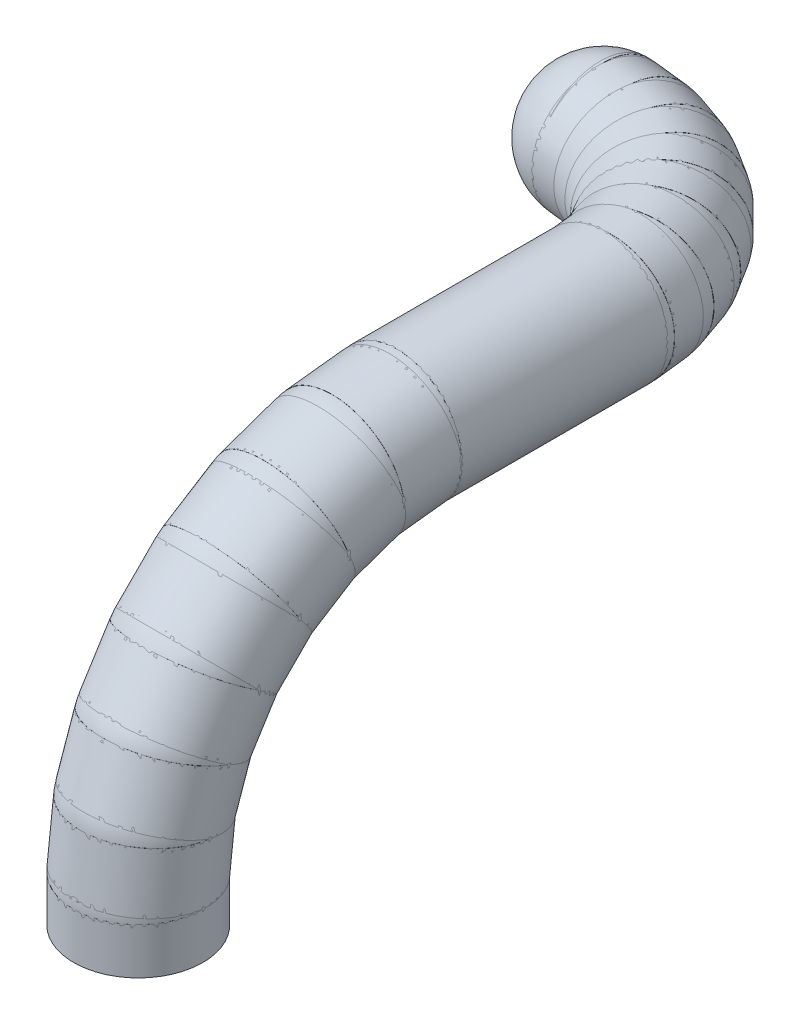
ISO-10303-21;
HEADER;
FILE_DESCRIPTION(('STEP AP214'),'2;1');
FILE_NAME('part.step','',(''),(''),'','','');
FILE_SCHEMA(('AUTOMOTIVE_DESIGN { 1 0 10303 214 1 1 1 1 }'));
ENDSEC;
DATA;
#1=APPLICATION_CONTEXT('core data for automotive mechanical design processes');
#2=APPLICATION_PROTOCOL_DEFINITION('international standard','automotive_design',2000,#1);
#3=PRODUCT_CONTEXT('',#1,'mechanical');
#4=PRODUCT('Part','Part','',(#3));
#5=PRODUCT_RELATED_PRODUCT_CATEGORY('part','',(#4));
#6=PRODUCT_DEFINITION_FORMATION('','',#4);
#7=PRODUCT_DEFINITION_CONTEXT('part definition',#1,'design');
#8=PRODUCT_DEFINITION('design','',#6,#7);
#9=PRODUCT_DEFINITION_SHAPE('','',#8);
#10=(LENGTH_UNIT() NAMED_UNIT(*) SI_UNIT(.MILLI.,.METRE.));
#11=(NAMED_UNIT(*) PLANE_ANGLE_UNIT() SI_UNIT($,.RADIAN.));
#12=(NAMED_UNIT(*) SI_UNIT($,.STERADIAN.) SOLID_ANGLE_UNIT());
#13=UNCERTAINTY_MEASURE_WITH_UNIT(LENGTH_MEASURE(1.E-05),#10,'distance_accuracy_value','');
#14=(GEOMETRIC_REPRESENTATION_CONTEXT(3) GLOBAL_UNCERTAINTY_ASSIGNED_CONTEXT((#13)) GLOBAL_UNIT_ASSIGNED_CONTEXT((#10,
#11,#12)) REPRESENTATION_CONTEXT('',''));
#15=CARTESIAN_POINT('',(0.,0.,0.));
#16=DIRECTION('',(0.,0.,1.));
#17=DIRECTION('',(1.,0.,0.));
#18=AXIS2_PLACEMENT_3D('',#15,#16,#17);
#19=CARTESIAN_POINT('',(24.,-97.5,196.));
#20=DIRECTION('',(1.,0.,0.));
#21=DIRECTION('',(0.,1.,0.));
#22=AXIS2_PLACEMENT_3D('',#19,#20,#21);
#23=PLANE('',#22);
#24=CARTESIAN_POINT('',(24.,-97.5,196.));
#25=DIRECTION('',(1.,0.,0.));
#26=DIRECTION('',(0.,0.,1.));
#27=AXIS2_PLACEMENT_3D('',#24,#25,#26);
#28=CIRCLE('',#27,3.5);
#29=CARTESIAN_POINT('',(24.,-97.5,199.5));
#30=VERTEX_POINT('',#29);
#31=EDGE_CURVE('P0_E11',#30,#30,#28,.T.);
#32=ORIENTED_EDGE('',*,*,#31,.F.);
#33=EDGE_LOOP('',(#32));
#34=FACE_BOUND('',#33,.T.);
#35=ADVANCED_FACE('P0_F16',(#34),#23,.F.);
#36=CARTESIAN_POINT('',(24.16,-97.5,196.));
#37=DIRECTION('',(1.,0.,0.));
#38=DIRECTION('',(0.,1.,0.));
#39=AXIS2_PLACEMENT_3D('',#36,#37,#38);
#40=PLANE('',#39);
#41=CARTESIAN_POINT('',(24.16,-97.5,196.));
#42=DIRECTION('',(1.,0.,0.));
#43=DIRECTION('',(0.,0.,1.));
#44=AXIS2_PLACEMENT_3D('',#41,#42,#43);
#45=CIRCLE('',#44,3.5);
#46=CARTESIAN_POINT('',(24.16,-97.5,199.5));
#47=VERTEX_POINT('',#46);
#48=EDGE_CURVE('P0_E40',#47,#47,#45,.T.);
#49=ORIENTED_EDGE('',*,*,#48,.T.);
#50=EDGE_LOOP('',(#49));
#51=FACE_BOUND('',#50,.T.);
#52=ADVANCED_FACE('P0_F43',(#51),#40,.T.);
#53=CARTESIAN_POINT('',(24.,-97.5,196.));
#54=DIRECTION('',(1.,0.,0.));
#55=DIRECTION('',(0.,0.,1.));
#56=AXIS2_PLACEMENT_3D('',#53,#54,#55);
#57=CYLINDRICAL_SURFACE('',#56,3.5);
#58=ORIENTED_EDGE('',*,*,#48,.F.);
#59=DIRECTION('',(1.,0.,0.));
#60=VECTOR('',#59,1.);
#61=CARTESIAN_POINT('',(24.,-97.5,199.5));
#62=LINE('',#61,#60);
#63=EDGE_CURVE('P0_E24',#30,#47,#62,.T.);
#64=ORIENTED_EDGE('',*,*,#63,.F.);
#65=ORIENTED_EDGE('',*,*,#31,.T.);
#66=ORIENTED_EDGE('',*,*,#63,.T.);
#67=EDGE_LOOP('',(#58,#64,#65,#66));
#68=FACE_BOUND('',#67,.T.);
#69=ADVANCED_FACE('P0_F39',(#68),#57,.T.);
#70=CLOSED_SHELL('',(#35,#52,#69));
#71=MANIFOLD_SOLID_BREP('P0_B1',#70);
#72=CARTESIAN_POINT('',(24.16,-97.5,196.));
#73=DIRECTION('',(0.993712209893274,0.,0.111964476103031));
#74=DIRECTION('',(0.,-1.,0.));
#75=AXIS2_PLACEMENT_3D('',#72,#73,#74);
#76=PLANE('',#75);
#77=CARTESIAN_POINT('',(24.16,-97.5,196.));
#78=DIRECTION('',(0.993712209893274,0.,0.111964476103031));
#79=DIRECTION('',(-0.111964476103031,0.,0.993712209893274));
#80=AXIS2_PLACEMENT_3D('',#77,#78,#79);
#81=CIRCLE('',#80,3.5);
#82=CARTESIAN_POINT('',(23.768124333638,-97.5,199.47799273462));
#83=VERTEX_POINT('',#82);
#84=EDGE_CURVE('P1_E11',#83,#83,#81,.T.);
#85=ORIENTED_EDGE('',*,*,#84,.F.);
#86=EDGE_LOOP('',(#85));
#87=FACE_BOUND('',#86,.T.);
#88=ADVANCED_FACE('P1_F16',(#87),#76,.F.);
#89=CARTESIAN_POINT('',(25.904564122218,-97.5,196.19656516849));
#90=DIRECTION('',(0.993712209893274,0.,0.111964476103031));
#91=DIRECTION('',(0.,-1.,0.));
#92=AXIS2_PLACEMENT_3D('',#89,#90,#91);
#93=PLANE('',#92);
#94=CARTESIAN_POINT('',(25.904564122218,-97.5,196.19656516849));
#95=DIRECTION('',(0.993712209893274,0.,0.111964476103031));
#96=DIRECTION('',(-0.111964476103031,0.,0.993712209893274));
#97=AXIS2_PLACEMENT_3D('',#94,#95,#96);
#98=CIRCLE('',#97,3.5);
#99=CARTESIAN_POINT('',(25.512688455856,-97.5,199.67455790312));
#100=VERTEX_POINT('',#99);
#101=EDGE_CURVE('P1_E40',#100,#100,#98,.T.);
#102=ORIENTED_EDGE('',*,*,#101,.T.);
#103=EDGE_LOOP('',(#102));
#104=FACE_BOUND('',#103,.T.);
#105=ADVANCED_FACE('P1_F44',(#104),#93,.T.);
#106=CARTESIAN_POINT('',(24.16,-97.5,196.));
#107=DIRECTION('',(0.993712209893274,0.,0.111964476103031));
#108=DIRECTION('',(-0.111964476103031,0.,0.993712209893274));
#109=AXIS2_PLACEMENT_3D('',#106,#107,#108);
#110=CYLINDRICAL_SURFACE('',#109,3.5);
#111=ORIENTED_EDGE('',*,*,#101,.F.);
#112=DIRECTION('',(0.993712209893274,0.,0.111964476103031));
#113=VECTOR('',#112,1.);
#114=CARTESIAN_POINT('',(23.768124333638,-97.5,199.47799273462));
#115=LINE('',#114,#113);
#116=EDGE_CURVE('P1_E24',#83,#100,#115,.T.);
#117=ORIENTED_EDGE('',*,*,#116,.F.);
#118=ORIENTED_EDGE('',*,*,#84,.T.);
#119=ORIENTED_EDGE('',*,*,#116,.T.);
#120=EDGE_LOOP('',(#111,#117,#118,#119));
#121=FACE_BOUND('',#120,.T.);
#122=ADVANCED_FACE('P1_F39',(#121),#110,.T.);
#123=CLOSED_SHELL('',(#88,#105,#122));
#124=MANIFOLD_SOLID_BREP('P1_B1',#123);
#125=CARTESIAN_POINT('',(25.904564122218,-97.5,196.19656516849));
#126=DIRECTION('',(0.943883330308379,0.,0.330279061955133));
#127=DIRECTION('',(0.,-1.,0.));
#128=AXIS2_PLACEMENT_3D('',#125,#126,#127);
#129=PLANE('',#128);
#130=CARTESIAN_POINT('',(25.904564122218,-97.5,196.19656516849));
#131=DIRECTION('',(0.94388333030838,0.,0.330279061955133));
#132=DIRECTION('',(-0.330279061955133,0.,0.94388333030838));
#133=AXIS2_PLACEMENT_3D('',#130,#131,#132);
#134=CIRCLE('',#133,3.5);
#135=CARTESIAN_POINT('',(24.748587405374,-97.5,199.50015682457));
#136=VERTEX_POINT('',#135);
#137=EDGE_CURVE('P2_E11',#136,#136,#134,.T.);
#138=ORIENTED_EDGE('',*,*,#137,.F.);
#139=EDGE_LOOP('',(#138));
#140=FACE_BOUND('',#139,.T.);
#141=ADVANCED_FACE('P2_F16',(#140),#129,.F.);
#142=CARTESIAN_POINT('',(27.561648514682,-97.5,196.77640407564));
#143=DIRECTION('',(0.943883330308379,0.,0.330279061955133));
#144=DIRECTION('',(0.,-1.,0.));
#145=AXIS2_PLACEMENT_3D('',#142,#143,#144);
#146=PLANE('',#145);
#147=CARTESIAN_POINT('',(27.561648514682,-97.5,196.77640407564));
#148=DIRECTION('',(0.94388333030838,0.,0.330279061955133));
#149=DIRECTION('',(-0.330279061955133,0.,0.94388333030838));
#150=AXIS2_PLACEMENT_3D('',#147,#148,#149);
#151=CIRCLE('',#150,3.5);
#152=CARTESIAN_POINT('',(26.405671797839,-97.5,200.07999573172));
#153=VERTEX_POINT('',#152);
#154=EDGE_CURVE('P2_E40',#153,#153,#151,.T.);
#155=ORIENTED_EDGE('',*,*,#154,.T.);
#156=EDGE_LOOP('',(#155));
#157=FACE_BOUND('',#156,.T.);
#158=ADVANCED_FACE('P2_F43',(#157),#146,.T.);
#159=CARTESIAN_POINT('',(25.904564122218,-97.5,196.19656516849));
#160=DIRECTION('',(0.94388333030838,0.,0.330279061955133));
#161=DIRECTION('',(-0.330279061955133,0.,0.94388333030838));
#162=AXIS2_PLACEMENT_3D('',#159,#160,#161);
#163=CYLINDRICAL_SURFACE('',#162,3.5);
#164=ORIENTED_EDGE('',*,*,#154,.F.);
#165=DIRECTION('',(0.943883330308379,0.,0.330279061955133));
#166=VECTOR('',#165,1.);
#167=CARTESIAN_POINT('',(24.748587405374,-97.5,199.50015682457));
#168=LINE('',#167,#166);
#169=EDGE_CURVE('P2_E20',#136,#153,#168,.T.);
#170=ORIENTED_EDGE('',*,*,#169,.F.);
#171=ORIENTED_EDGE('',*,*,#137,.T.);
#172=ORIENTED_EDGE('',*,*,#169,.T.);
#173=EDGE_LOOP('',(#164,#170,#171,#172));
#174=FACE_BOUND('',#173,.T.);
#175=ADVANCED_FACE('P2_F18',(#174),#163,.T.);
#176=CLOSED_SHELL('',(#141,#158,#175));
#177=MANIFOLD_SOLID_BREP('P2_B1',#176);
#178=CARTESIAN_POINT('',(27.561648514682,-97.5,196.77640407564));
#179=DIRECTION('',(0.846724199228355,0.,0.532032076515223));
#180=DIRECTION('',(0.,-1.,0.));
#181=AXIS2_PLACEMENT_3D('',#178,#179,#180);
#182=PLANE('',#181);
#183=CARTESIAN_POINT('',(27.561648514682,-97.5,196.77640407564));
#184=DIRECTION('',(0.846724199228355,0.,0.532032076515223));
#185=DIRECTION('',(-0.532032076515223,0.,0.846724199228355));
#186=AXIS2_PLACEMENT_3D('',#183,#184,#185);
#187=CIRCLE('',#186,3.5);
#188=CARTESIAN_POINT('',(25.699536246878,-97.5,199.73993877294));
#189=VERTEX_POINT('',#188);
#190=EDGE_CURVE('P3_E11',#189,#189,#187,.T.);
#191=ORIENTED_EDGE('',*,*,#190,.F.);
#192=EDGE_LOOP('',(#191));
#193=FACE_BOUND('',#192,.T.);
#194=ADVANCED_FACE('P3_F16',(#193),#182,.F.);
#195=CARTESIAN_POINT('',(29.048160046572,-97.5,197.71044117745));
#196=DIRECTION('',(0.846724199228355,0.,0.532032076515223));
#197=DIRECTION('',(0.,-1.,0.));
#198=AXIS2_PLACEMENT_3D('',#195,#196,#197);
#199=PLANE('',#198);
#200=CARTESIAN_POINT('',(29.048160046572,-97.5,197.71044117745));
#201=DIRECTION('',(0.846724199228355,0.,0.532032076515223));
#202=DIRECTION('',(-0.532032076515223,0.,0.846724199228355));
#203=AXIS2_PLACEMENT_3D('',#200,#201,#202);
#204=CIRCLE('',#203,3.5);
#205=CARTESIAN_POINT('',(27.186047778769,-97.5,200.67397587475));
#206=VERTEX_POINT('',#205);
#207=EDGE_CURVE('P3_E20',#206,#206,#204,.T.);
#208=ORIENTED_EDGE('',*,*,#207,.T.);
#209=EDGE_LOOP('',(#208));
#210=FACE_BOUND('',#209,.T.);
#211=ADVANCED_FACE('P3_F18',(#210),#199,.T.);
#212=CARTESIAN_POINT('',(27.561648514682,-97.5,196.77640407564));
#213=DIRECTION('',(0.846724199228355,0.,0.532032076515223));
#214=DIRECTION('',(-0.532032076515223,0.,0.846724199228355));
#215=AXIS2_PLACEMENT_3D('',#212,#213,#214);
#216=CYLINDRICAL_SURFACE('',#215,3.5);
#217=ORIENTED_EDGE('',*,*,#207,.F.);
#218=DIRECTION('',(0.846724199228355,0.,0.532032076515223));
#219=VECTOR('',#218,1.);
#220=CARTESIAN_POINT('',(25.699536246878,-97.5,199.73993877294));
#221=LINE('',#220,#219);
#222=EDGE_CURVE('P3_E27',#189,#206,#221,.T.);
#223=ORIENTED_EDGE('',*,*,#222,.F.);
#224=ORIENTED_EDGE('',*,*,#190,.T.);
#225=ORIENTED_EDGE('',*,*,#222,.T.);
#226=EDGE_LOOP('',(#217,#223,#224,#225));
#227=FACE_BOUND('',#226,.T.);
#228=ADVANCED_FACE('P3_F42',(#227),#216,.T.);
#229=CLOSED_SHELL('',(#194,#211,#228));
#230=MANIFOLD_SOLID_BREP('P3_B1',#229);
#231=CARTESIAN_POINT('',(29.048160046572,-97.5,197.71044117745));
#232=DIRECTION('',(0.707106781186548,0.,0.707106781186548));
#233=DIRECTION('',(0.,-1.,0.));
#234=AXIS2_PLACEMENT_3D('',#231,#232,#233);
#235=PLANE('',#234);
#236=CARTESIAN_POINT('',(29.048160046572,-97.5,197.71044117745));
#237=DIRECTION('',(0.707106781186548,0.,0.707106781186548));
#238=DIRECTION('',(-0.707106781186548,0.,0.707106781186548));
#239=AXIS2_PLACEMENT_3D('',#236,#237,#238);
#240=CIRCLE('',#239,3.5);
#241=CARTESIAN_POINT('',(26.57328631242,-97.5,200.1853149116));
#242=VERTEX_POINT('',#241);
#243=EDGE_CURVE('P4_E11',#242,#242,#240,.T.);
#244=ORIENTED_EDGE('',*,*,#243,.F.);
#245=EDGE_LOOP('',(#244));
#246=FACE_BOUND('',#245,.T.);
#247=ADVANCED_FACE('P4_F16',(#246),#235,.F.);
#248=CARTESIAN_POINT('',(30.289558822549,-97.5,198.95183995342));
#249=DIRECTION('',(0.707106781186548,0.,0.707106781186548));
#250=DIRECTION('',(0.,-1.,0.));
#251=AXIS2_PLACEMENT_3D('',#248,#249,#250);
#252=PLANE('',#251);
#253=CARTESIAN_POINT('',(30.289558822549,-97.5,198.95183995342));
#254=DIRECTION('',(0.707106781186548,0.,0.707106781186548));
#255=DIRECTION('',(-0.707106781186548,0.,0.707106781186548));
#256=AXIS2_PLACEMENT_3D('',#253,#254,#255);
#257=CIRCLE('',#256,3.5);
#258=CARTESIAN_POINT('',(27.814685088396,-97.5,201.42671368758));
#259=VERTEX_POINT('',#258);
#260=EDGE_CURVE('P4_E19',#259,#259,#257,.T.);
#261=ORIENTED_EDGE('',*,*,#260,.T.);
#262=EDGE_LOOP('',(#261));
#263=FACE_BOUND('',#262,.T.);
#264=ADVANCED_FACE('P4_F44',(#263),#252,.T.);
#265=CARTESIAN_POINT('',(29.048160046572,-97.5,197.71044117745));
#266=DIRECTION('',(0.707106781186548,0.,0.707106781186548));
#267=DIRECTION('',(-0.707106781186548,0.,0.707106781186548));
#268=AXIS2_PLACEMENT_3D('',#265,#266,#267);
#269=CYLINDRICAL_SURFACE('',#268,3.5);
#270=ORIENTED_EDGE('',*,*,#260,.F.);
#271=DIRECTION('',(0.707106781186548,0.,0.707106781186548));
#272=VECTOR('',#271,1.);
#273=CARTESIAN_POINT('',(26.57328631242,-97.5,200.1853149116));
#274=LINE('',#273,#272);
#275=EDGE_CURVE('P4_E25',#242,#259,#274,.T.);
#276=ORIENTED_EDGE('',*,*,#275,.F.);
#277=ORIENTED_EDGE('',*,*,#243,.T.);
#278=ORIENTED_EDGE('',*,*,#275,.T.);
#279=EDGE_LOOP('',(#270,#276,#277,#278));
#280=FACE_BOUND('',#279,.T.);
#281=ADVANCED_FACE('P4_F40',(#280),#269,.T.);
#282=CLOSED_SHELL('',(#247,#264,#281));
#283=MANIFOLD_SOLID_BREP('P4_B1',#282);
#284=CARTESIAN_POINT('',(30.289558822549,-97.5,198.95183995342));
#285=DIRECTION('',(0.532032076515223,0.,0.846724199228355));
#286=DIRECTION('',(0.,-1.,0.));
#287=AXIS2_PLACEMENT_3D('',#284,#285,#286);
#288=PLANE('',#287);
#289=CARTESIAN_POINT('',(30.289558822549,-97.5,198.95183995342));
#290=DIRECTION('',(0.532032076515223,0.,0.846724199228355));
#291=DIRECTION('',(0.846724199228355,0.,-0.532032076515223));
#292=AXIS2_PLACEMENT_3D('',#289,#290,#291);
#293=CIRCLE('',#292,3.5);
#294=CARTESIAN_POINT('',(33.253093519848,-97.5,197.08972768562));
#295=VERTEX_POINT('',#294);
#296=EDGE_CURVE('P5_E11',#295,#295,#293,.T.);
#297=ORIENTED_EDGE('',*,*,#296,.F.);
#298=EDGE_LOOP('',(#297));
#299=FACE_BOUND('',#298,.T.);
#300=ADVANCED_FACE('P5_F16',(#299),#288,.F.);
#301=CARTESIAN_POINT('',(31.223595924355,-97.5,200.43835148531));
#302=DIRECTION('',(0.532032076515223,0.,0.846724199228355));
#303=DIRECTION('',(0.,-1.,0.));
#304=AXIS2_PLACEMENT_3D('',#301,#302,#303);
#305=PLANE('',#304);
#306=CARTESIAN_POINT('',(31.223595924355,-97.5,200.43835148531));
#307=DIRECTION('',(0.532032076515223,0.,0.846724199228355));
#308=DIRECTION('',(0.846724199228355,0.,-0.532032076515223));
#309=AXIS2_PLACEMENT_3D('',#306,#307,#308);
#310=CIRCLE('',#309,3.5);
#311=CARTESIAN_POINT('',(34.187130621654,-97.5,198.57623921751));
#312=VERTEX_POINT('',#311);
#313=EDGE_CURVE('P5_E41',#312,#312,#310,.T.);
#314=ORIENTED_EDGE('',*,*,#313,.T.);
#315=EDGE_LOOP('',(#314));
#316=FACE_BOUND('',#315,.T.);
#317=ADVANCED_FACE('P5_F44',(#316),#305,.T.);
#318=CARTESIAN_POINT('',(30.289558822549,-97.5,198.95183995342));
#319=DIRECTION('',(0.532032076515223,0.,0.846724199228355));
#320=DIRECTION('',(0.846724199228355,0.,-0.532032076515223));
#321=AXIS2_PLACEMENT_3D('',#318,#319,#320);
#322=CYLINDRICAL_SURFACE('',#321,3.5);
#323=ORIENTED_EDGE('',*,*,#313,.F.);
#324=DIRECTION('',(0.532032076515223,0.,0.846724199228355));
#325=VECTOR('',#324,1.);
#326=CARTESIAN_POINT('',(33.253093519848,-97.5,197.08972768562));
#327=LINE('',#326,#325);
#328=EDGE_CURVE('P5_E20',#295,#312,#327,.T.);
#329=ORIENTED_EDGE('',*,*,#328,.F.);
#330=ORIENTED_EDGE('',*,*,#296,.T.);
#331=ORIENTED_EDGE('',*,*,#328,.T.);
#332=EDGE_LOOP('',(#323,#329,#330,#331));
#333=FACE_BOUND('',#332,.T.);
#334=ADVANCED_FACE('P5_F18',(#333),#322,.T.);
#335=CLOSED_SHELL('',(#300,#317,#334));
#336=MANIFOLD_SOLID_BREP('P5_B1',#335);
#337=CARTESIAN_POINT('',(31.223595924355,-97.5,200.43835148531));
#338=DIRECTION('',(0.330279061955133,0.,0.943883330308379));
#339=DIRECTION('',(0.,-1.,0.));
#340=AXIS2_PLACEMENT_3D('',#337,#338,#339);
#341=PLANE('',#340);
#342=CARTESIAN_POINT('',(31.223595924355,-97.5,200.43835148531));
#343=DIRECTION('',(0.330279061955133,0.,0.94388333030838));
#344=DIRECTION('',(0.94388333030838,0.,-0.330279061955133));
#345=AXIS2_PLACEMENT_3D('',#342,#343,#344);
#346=CIRCLE('',#345,3.5);
#347=CARTESIAN_POINT('',(34.527187580434,-97.5,199.28237476847));
#348=VERTEX_POINT('',#347);
#349=EDGE_CURVE('P6_E11',#348,#348,#346,.T.);
#350=ORIENTED_EDGE('',*,*,#349,.F.);
#351=EDGE_LOOP('',(#350));
#352=FACE_BOUND('',#351,.T.);
#353=ADVANCED_FACE('P6_F16',(#352),#341,.F.);
#354=CARTESIAN_POINT('',(31.803434831505,-97.5,202.09543587778));
#355=DIRECTION('',(0.330279061955133,0.,0.943883330308379));
#356=DIRECTION('',(0.,-1.,0.));
#357=AXIS2_PLACEMENT_3D('',#354,#355,#356);
#358=PLANE('',#357);
#359=CARTESIAN_POINT('',(31.803434831505,-97.5,202.09543587778));
#360=DIRECTION('',(0.330279061955133,0.,0.94388333030838));
#361=DIRECTION('',(0.94388333030838,0.,-0.330279061955133));
#362=AXIS2_PLACEMENT_3D('',#359,#360,#361);
#363=CIRCLE('',#362,3.5);
#364=CARTESIAN_POINT('',(35.107026487585,-97.5,200.93945916093));
#365=VERTEX_POINT('',#364);
#366=EDGE_CURVE('P6_E40',#365,#365,#363,.T.);
#367=ORIENTED_EDGE('',*,*,#366,.T.);
#368=EDGE_LOOP('',(#367));
#369=FACE_BOUND('',#368,.T.);
#370=ADVANCED_FACE('P6_F43',(#369),#358,.T.);
#371=CARTESIAN_POINT('',(31.223595924355,-97.5,200.43835148531));
#372=DIRECTION('',(0.330279061955133,0.,0.94388333030838));
#373=DIRECTION('',(0.94388333030838,0.,-0.330279061955133));
#374=AXIS2_PLACEMENT_3D('',#371,#372,#373);
#375=CYLINDRICAL_SURFACE('',#374,3.5);
#376=ORIENTED_EDGE('',*,*,#366,.F.);
#377=DIRECTION('',(0.330279061955133,0.,0.943883330308379));
#378=VECTOR('',#377,1.);
#379=CARTESIAN_POINT('',(34.527187580434,-97.5,199.28237476847));
#380=LINE('',#379,#378);
#381=EDGE_CURVE('P6_E25',#348,#365,#380,.T.);
#382=ORIENTED_EDGE('',*,*,#381,.F.);
#383=ORIENTED_EDGE('',*,*,#349,.T.);
#384=ORIENTED_EDGE('',*,*,#381,.T.);
#385=EDGE_LOOP('',(#376,#382,#383,#384));
#386=FACE_BOUND('',#385,.T.);
#387=ADVANCED_FACE('P6_F39',(#386),#375,.T.);
#388=CLOSED_SHELL('',(#353,#370,#387));
#389=MANIFOLD_SOLID_BREP('P6_B1',#388);
#390=CARTESIAN_POINT('',(31.803434831505,-97.5,202.09543587778));
#391=DIRECTION('',(0.111964476103031,0.,0.993712209893274));
#392=DIRECTION('',(0.,-1.,0.));
#393=AXIS2_PLACEMENT_3D('',#390,#391,#392);
#394=PLANE('',#393);
#395=CARTESIAN_POINT('',(31.803434831505,-97.5,202.09543587778));
#396=DIRECTION('',(0.111964476103031,0.,0.993712209893274));
#397=DIRECTION('',(0.993712209893274,0.,-0.111964476103031));
#398=AXIS2_PLACEMENT_3D('',#395,#396,#397);
#399=CIRCLE('',#398,3.5);
#400=CARTESIAN_POINT('',(35.281427566132,-97.5,201.70356021142));
#401=VERTEX_POINT('',#400);
#402=EDGE_CURVE('P7_E11',#401,#401,#399,.T.);
#403=ORIENTED_EDGE('',*,*,#402,.F.);
#404=EDGE_LOOP('',(#403));
#405=FACE_BOUND('',#404,.T.);
#406=ADVANCED_FACE('P7_F16',(#405),#394,.F.);
#407=CARTESIAN_POINT('',(32.,-97.5,203.84));
#408=DIRECTION('',(0.111964476103031,0.,0.993712209893274));
#409=DIRECTION('',(0.,-1.,0.));
#410=AXIS2_PLACEMENT_3D('',#407,#408,#409);
#411=PLANE('',#410);
#412=CARTESIAN_POINT('',(32.,-97.5,203.84));
#413=DIRECTION('',(0.111964476103031,0.,0.993712209893274));
#414=DIRECTION('',(0.993712209893274,0.,-0.111964476103031));
#415=AXIS2_PLACEMENT_3D('',#412,#413,#414);
#416=CIRCLE('',#415,3.5);
#417=CARTESIAN_POINT('',(35.477992734626,-97.5,203.44812433363));
#418=VERTEX_POINT('',#417);
#419=EDGE_CURVE('P7_E41',#418,#418,#416,.T.);
#420=ORIENTED_EDGE('',*,*,#419,.T.);
#421=EDGE_LOOP('',(#420));
#422=FACE_BOUND('',#421,.T.);
#423=ADVANCED_FACE('P7_F44',(#422),#411,.T.);
#424=CARTESIAN_POINT('',(31.803434831505,-97.5,202.09543587778));
#425=DIRECTION('',(0.111964476103031,0.,0.993712209893274));
#426=DIRECTION('',(0.993712209893274,0.,-0.111964476103031));
#427=AXIS2_PLACEMENT_3D('',#424,#425,#426);
#428=CYLINDRICAL_SURFACE('',#427,3.5);
#429=ORIENTED_EDGE('',*,*,#419,.F.);
#430=DIRECTION('',(0.111964476103031,0.,0.993712209893274));
#431=VECTOR('',#430,1.);
#432=CARTESIAN_POINT('',(35.281427566132,-97.5,201.70356021142));
#433=LINE('',#432,#431);
#434=EDGE_CURVE('P7_E19',#401,#418,#433,.T.);
#435=ORIENTED_EDGE('',*,*,#434,.F.);
#436=ORIENTED_EDGE('',*,*,#402,.T.);
#437=ORIENTED_EDGE('',*,*,#434,.T.);
#438=EDGE_LOOP('',(#429,#435,#436,#437));
#439=FACE_BOUND('',#438,.T.);
#440=ADVANCED_FACE('P7_F40',(#439),#428,.T.);
#441=CLOSED_SHELL('',(#406,#423,#440));
#442=MANIFOLD_SOLID_BREP('P7_B1',#441);
#443=CARTESIAN_POINT('',(32.,-97.5,203.84));
#444=DIRECTION('',(0.,0.,1.));
#445=DIRECTION('',(1.,0.,0.));
#446=AXIS2_PLACEMENT_3D('',#443,#444,#445);
#447=PLANE('',#446);
#448=CARTESIAN_POINT('',(32.,-97.5,203.84));
#449=DIRECTION('',(0.,0.,1.));
#450=DIRECTION('',(1.,0.,0.));
#451=AXIS2_PLACEMENT_3D('',#448,#449,#450);
#452=CIRCLE('',#451,3.5);
#453=CARTESIAN_POINT('',(35.5,-97.5,203.84));
#454=VERTEX_POINT('',#453);
#455=EDGE_CURVE('P8_E11',#454,#454,#452,.T.);
#456=ORIENTED_EDGE('',*,*,#455,.F.);
#457=EDGE_LOOP('',(#456));
#458=FACE_BOUND('',#457,.T.);
#459=ADVANCED_FACE('P8_F16',(#458),#447,.F.);
#460=CARTESIAN_POINT('',(32.,-97.5,215.));
#461=DIRECTION('',(0.,0.,1.));
#462=DIRECTION('',(1.,0.,0.));
#463=AXIS2_PLACEMENT_3D('',#460,#461,#462);
#464=PLANE('',#463);
#465=CARTESIAN_POINT('',(32.,-97.5,215.));
#466=DIRECTION('',(0.,0.,1.));
#467=DIRECTION('',(1.,0.,0.));
#468=AXIS2_PLACEMENT_3D('',#465,#466,#467);
#469=CIRCLE('',#468,3.5);
#470=CARTESIAN_POINT('',(35.5,-97.5,215.));
#471=VERTEX_POINT('',#470);
#472=EDGE_CURVE('P8_E41',#471,#471,#469,.T.);
#473=ORIENTED_EDGE('',*,*,#472,.T.);
#474=EDGE_LOOP('',(#473));
#475=FACE_BOUND('',#474,.T.);
#476=ADVANCED_FACE('P8_F44',(#475),#464,.T.);
#477=CARTESIAN_POINT('',(32.,-97.5,203.84));
#478=DIRECTION('',(0.,0.,1.));
#479=DIRECTION('',(1.,0.,0.));
#480=AXIS2_PLACEMENT_3D('',#477,#478,#479);
#481=CYLINDRICAL_SURFACE('',#480,3.5);
#482=ORIENTED_EDGE('',*,*,#472,.F.);
#483=DIRECTION('',(0.,0.,1.));
#484=VECTOR('',#483,1.);
#485=CARTESIAN_POINT('',(35.5,-97.5,203.84));
#486=LINE('',#485,#484);
#487=EDGE_CURVE('P8_E19',#454,#471,#486,.T.);
#488=ORIENTED_EDGE('',*,*,#487,.F.);
#489=ORIENTED_EDGE('',*,*,#455,.T.);
#490=ORIENTED_EDGE('',*,*,#487,.T.);
#491=EDGE_LOOP('',(#482,#488,#489,#490));
#492=FACE_BOUND('',#491,.T.);
#493=ADVANCED_FACE('P8_F40',(#492),#481,.T.);
#494=CLOSED_SHELL('',(#459,#476,#493));
#495=MANIFOLD_SOLID_BREP('P8_B1',#494);
#496=CARTESIAN_POINT('',(32.,-97.5,215.));
#497=DIRECTION('',(0.,-0.111964476103031,0.993712209893274));
#498=DIRECTION('',(-1.,0.,0.));
#499=AXIS2_PLACEMENT_3D('',#496,#497,#498);
#500=PLANE('',#499);
#501=CARTESIAN_POINT('',(32.,-97.5,215.));
#502=DIRECTION('',(0.,-0.111964476103031,0.993712209893274));
#503=DIRECTION('',(0.,0.993712209893274,0.111964476103031));
#504=AXIS2_PLACEMENT_3D('',#501,#502,#503);
#505=CIRCLE('',#504,3.5);
#506=CARTESIAN_POINT('',(32.,-94.02200726537,215.39187566636));
#507=VERTEX_POINT('',#506);
#508=EDGE_CURVE('P9_E11',#507,#507,#505,.T.);
#509=ORIENTED_EDGE('',*,*,#508,.F.);
#510=EDGE_LOOP('',(#509));
#511=FACE_BOUND('',#510,.T.);
#512=ADVANCED_FACE('P9_F16',(#511),#500,.F.);
#513=CARTESIAN_POINT('',(32.,-97.85100922945,218.11529307538));
#514=DIRECTION('',(0.,-0.111964476103031,0.993712209893274));
#515=DIRECTION('',(-1.,0.,0.));
#516=AXIS2_PLACEMENT_3D('',#513,#514,#515);
#517=PLANE('',#516);
#518=CARTESIAN_POINT('',(32.,-97.85100922945,218.11529307538));
#519=DIRECTION('',(0.,-0.111964476103031,0.993712209893274));
#520=DIRECTION('',(0.,0.993712209893274,0.111964476103031));
#521=AXIS2_PLACEMENT_3D('',#518,#519,#520);
#522=CIRCLE('',#521,3.5);
#523=CARTESIAN_POINT('',(32.,-94.37301649482,218.50716874175));
#524=VERTEX_POINT('',#523);
#525=EDGE_CURVE('P9_E40',#524,#524,#522,.T.);
#526=ORIENTED_EDGE('',*,*,#525,.T.);
#527=EDGE_LOOP('',(#526));
#528=FACE_BOUND('',#527,.T.);
#529=ADVANCED_FACE('P9_F43',(#528),#517,.T.);
#530=CARTESIAN_POINT('',(32.,-97.5,215.));
#531=DIRECTION('',(0.,-0.111964476103031,0.993712209893274));
#532=DIRECTION('',(0.,0.993712209893274,0.111964476103031));
#533=AXIS2_PLACEMENT_3D('',#530,#531,#532);
#534=CYLINDRICAL_SURFACE('',#533,3.5);
#535=ORIENTED_EDGE('',*,*,#525,.F.);
#536=DIRECTION('',(0.,-0.111964476103031,0.993712209893274));
#537=VECTOR('',#536,1.);
#538=CARTESIAN_POINT('',(32.,-94.02200726537,215.39187566636));
#539=LINE('',#538,#537);
#540=EDGE_CURVE('P9_E19',#507,#524,#539,.T.);
#541=ORIENTED_EDGE('',*,*,#540,.F.);
#542=ORIENTED_EDGE('',*,*,#508,.T.);
#543=ORIENTED_EDGE('',*,*,#540,.T.);
#544=EDGE_LOOP('',(#535,#541,#542,#543));
#545=FACE_BOUND('',#544,.T.);
#546=ADVANCED_FACE('P9_F39',(#545),#534,.T.);
#547=CLOSED_SHELL('',(#512,#529,#546));
#548=MANIFOLD_SOLID_BREP('P9_B1',#547);
#549=CARTESIAN_POINT('',(32.,-97.85100922945,218.11529307538));
#550=DIRECTION('',(0.,-0.330279061955133,0.943883330308379));
#551=DIRECTION('',(-1.,0.,0.));
#552=AXIS2_PLACEMENT_3D('',#549,#550,#551);
#553=PLANE('',#552);
#554=CARTESIAN_POINT('',(32.,-97.85100922945,218.11529307538));
#555=DIRECTION('',(0.,-0.330279061955133,0.94388333030838));
#556=DIRECTION('',(0.,0.94388333030838,0.330279061955133));
#557=AXIS2_PLACEMENT_3D('',#554,#555,#556);
#558=CIRCLE('',#557,3.5);
#559=CARTESIAN_POINT('',(32.,-94.54741757337,219.27126979223));
#560=VERTEX_POINT('',#559);
#561=EDGE_CURVE('P10_E11',#560,#560,#558,.T.);
#562=ORIENTED_EDGE('',*,*,#561,.F.);
#563=EDGE_LOOP('',(#562));
#564=FACE_BOUND('',#563,.T.);
#565=ADVANCED_FACE('P10_F16',(#564),#553,.F.);
#566=CARTESIAN_POINT('',(32.,-98.88643584936,221.07437234764));
#567=DIRECTION('',(0.,-0.330279061955133,0.943883330308379));
#568=DIRECTION('',(-1.,0.,0.));
#569=AXIS2_PLACEMENT_3D('',#566,#567,#568);
#570=PLANE('',#569);
#571=CARTESIAN_POINT('',(32.,-98.88643584936,221.07437234764));
#572=DIRECTION('',(0.,-0.330279061955133,0.94388333030838));
#573=DIRECTION('',(0.,0.94388333030838,0.330279061955133));
#574=AXIS2_PLACEMENT_3D('',#571,#572,#573);
#575=CIRCLE('',#574,3.5);
#576=CARTESIAN_POINT('',(32.,-95.58284419328,222.23034906448));
#577=VERTEX_POINT('',#576);
#578=EDGE_CURVE('P10_E41',#577,#577,#575,.T.);
#579=ORIENTED_EDGE('',*,*,#578,.T.);
#580=EDGE_LOOP('',(#579));
#581=FACE_BOUND('',#580,.T.);
#582=ADVANCED_FACE('P10_F44',(#581),#570,.T.);
#583=CARTESIAN_POINT('',(32.,-97.85100922945,218.11529307538));
#584=DIRECTION('',(0.,-0.330279061955133,0.94388333030838));
#585=DIRECTION('',(0.,0.94388333030838,0.330279061955133));
#586=AXIS2_PLACEMENT_3D('',#583,#584,#585);
#587=CYLINDRICAL_SURFACE('',#586,3.5);
#588=ORIENTED_EDGE('',*,*,#578,.F.);
#589=DIRECTION('',(0.,-0.330279061955133,0.943883330308379));
#590=VECTOR('',#589,1.);
#591=CARTESIAN_POINT('',(32.,-94.54741757337,219.27126979223));
#592=LINE('',#591,#590);
#593=EDGE_CURVE('P10_E20',#560,#577,#592,.T.);
#594=ORIENTED_EDGE('',*,*,#593,.F.);
#595=ORIENTED_EDGE('',*,*,#561,.T.);
#596=ORIENTED_EDGE('',*,*,#593,.T.);
#597=EDGE_LOOP('',(#588,#594,#595,#596));
#598=FACE_BOUND('',#597,.T.);
#599=ADVANCED_FACE('P10_F18',(#598),#587,.T.);
#600=CLOSED_SHELL('',(#565,#582,#599));
#601=MANIFOLD_SOLID_BREP('P10_B1',#600);
#602=CARTESIAN_POINT('',(32.,-98.88643584936,221.07437234764));
#603=DIRECTION('',(0.,-0.532032076515223,0.846724199228355));
#604=DIRECTION('',(-1.,0.,0.));
#605=AXIS2_PLACEMENT_3D('',#602,#603,#604);
#606=PLANE('',#605);
#607=CARTESIAN_POINT('',(32.,-98.88643584936,221.07437234764));
#608=DIRECTION('',(0.,-0.532032076515223,0.846724199228355));
#609=DIRECTION('',(0.,0.846724199228355,0.532032076515223));
#610=AXIS2_PLACEMENT_3D('',#607,#608,#609);
#611=CIRCLE('',#610,3.5);
#612=CARTESIAN_POINT('',(32.,-95.92290115206,222.93648461544));
#613=VERTEX_POINT('',#612);
#614=EDGE_CURVE('P11_E11',#613,#613,#611,.T.);
#615=ORIENTED_EDGE('',*,*,#614,.F.);
#616=EDGE_LOOP('',(#615));
#617=FACE_BOUND('',#616,.T.);
#618=ADVANCED_FACE('P11_F16',(#617),#606,.F.);
#619=CARTESIAN_POINT('',(32.,-100.5543592454,223.72885722602));
#620=DIRECTION('',(0.,-0.532032076515223,0.846724199228355));
#621=DIRECTION('',(-1.,0.,0.));
#622=AXIS2_PLACEMENT_3D('',#619,#620,#621);
#623=PLANE('',#622);
#624=CARTESIAN_POINT('',(32.,-100.5543592454,223.72885722602));
#625=DIRECTION('',(0.,-0.532032076515223,0.846724199228355));
#626=DIRECTION('',(0.,0.846724199228355,0.532032076515223));
#627=AXIS2_PLACEMENT_3D('',#624,#625,#626);
#628=CIRCLE('',#627,3.5);
#629=CARTESIAN_POINT('',(32.,-97.59082454814,225.59096949382));
#630=VERTEX_POINT('',#629);
#631=EDGE_CURVE('P11_E40',#630,#630,#628,.T.);
#632=ORIENTED_EDGE('',*,*,#631,.T.);
#633=EDGE_LOOP('',(#632));
#634=FACE_BOUND('',#633,.T.);
#635=ADVANCED_FACE('P11_F44',(#634),#623,.T.);
#636=CARTESIAN_POINT('',(32.,-98.88643584936,221.07437234764));
#637=DIRECTION('',(0.,-0.532032076515223,0.846724199228355));
#638=DIRECTION('',(0.,0.846724199228355,0.532032076515223));
#639=AXIS2_PLACEMENT_3D('',#636,#637,#638);
#640=CYLINDRICAL_SURFACE('',#639,3.5);
#641=ORIENTED_EDGE('',*,*,#631,.F.);
#642=DIRECTION('',(0.,-0.532032076515223,0.846724199228355));
#643=VECTOR('',#642,1.);
#644=CARTESIAN_POINT('',(32.,-95.92290115206,222.93648461544));
#645=LINE('',#644,#643);
#646=EDGE_CURVE('P11_E24',#613,#630,#645,.T.);
#647=ORIENTED_EDGE('',*,*,#646,.F.);
#648=ORIENTED_EDGE('',*,*,#614,.T.);
#649=ORIENTED_EDGE('',*,*,#646,.T.);
#650=EDGE_LOOP('',(#641,#647,#648,#649));
#651=FACE_BOUND('',#650,.T.);
#652=ADVANCED_FACE('P11_F39',(#651),#640,.T.);
#653=CLOSED_SHELL('',(#618,#635,#652));
#654=MANIFOLD_SOLID_BREP('P11_B1',#653);
#655=CARTESIAN_POINT('',(32.,-100.5543592454,223.72885722602));
#656=DIRECTION('',(0.,-0.707106781186548,0.707106781186548));
#657=DIRECTION('',(-1.,0.,0.));
#658=AXIS2_PLACEMENT_3D('',#655,#656,#657);
#659=PLANE('',#658);
#660=CARTESIAN_POINT('',(32.,-100.5543592454,223.72885722602));
#661=DIRECTION('',(0.,-0.707106781186548,0.707106781186548));
#662=DIRECTION('',(0.,0.707106781186548,0.707106781186548));
#663=AXIS2_PLACEMENT_3D('',#660,#661,#662);
#664=CIRCLE('',#663,3.5);
#665=CARTESIAN_POINT('',(32.,-98.07948551129,226.20373096017));
#666=VERTEX_POINT('',#665);
#667=EDGE_CURVE('P12_E11',#666,#666,#664,.T.);
#668=ORIENTED_EDGE('',*,*,#667,.F.);
#669=EDGE_LOOP('',(#668));
#670=FACE_BOUND('',#669,.T.);
#671=ADVANCED_FACE('P12_F16',(#670),#659,.F.);
#672=CARTESIAN_POINT('',(32.,-102.7711427739,225.94564075455));
#673=DIRECTION('',(0.,-0.707106781186548,0.707106781186548));
#674=DIRECTION('',(-1.,0.,0.));
#675=AXIS2_PLACEMENT_3D('',#672,#673,#674);
#676=PLANE('',#675);
#677=CARTESIAN_POINT('',(32.,-102.7711427739,225.94564075455));
#678=DIRECTION('',(0.,-0.707106781186548,0.707106781186548));
#679=DIRECTION('',(0.,0.707106781186548,0.707106781186548));
#680=AXIS2_PLACEMENT_3D('',#677,#678,#679);
#681=CIRCLE('',#680,3.5);
#682=CARTESIAN_POINT('',(32.,-100.2962690398,228.4205144887));
#683=VERTEX_POINT('',#682);
#684=EDGE_CURVE('P12_E40',#683,#683,#681,.T.);
#685=ORIENTED_EDGE('',*,*,#684,.T.);
#686=EDGE_LOOP('',(#685));
#687=FACE_BOUND('',#686,.T.);
#688=ADVANCED_FACE('P12_F43',(#687),#676,.T.);
#689=CARTESIAN_POINT('',(32.,-100.5543592454,223.72885722602));
#690=DIRECTION('',(0.,-0.707106781186548,0.707106781186548));
#691=DIRECTION('',(0.,0.707106781186548,0.707106781186548));
#692=AXIS2_PLACEMENT_3D('',#689,#690,#691);
#693=CYLINDRICAL_SURFACE('',#692,3.5);
#694=ORIENTED_EDGE('',*,*,#684,.F.);
#695=DIRECTION('',(0.,-0.707106781186548,0.707106781186548));
#696=VECTOR('',#695,1.);
#697=CARTESIAN_POINT('',(32.,-98.07948551129,226.20373096017));
#698=LINE('',#697,#696);
#699=EDGE_CURVE('P12_E19',#666,#683,#698,.T.);
#700=ORIENTED_EDGE('',*,*,#699,.F.);
#701=ORIENTED_EDGE('',*,*,#667,.T.);
#702=ORIENTED_EDGE('',*,*,#699,.T.);
#703=EDGE_LOOP('',(#694,#700,#701,#702));
#704=FACE_BOUND('',#703,.T.);
#705=ADVANCED_FACE('P12_F39',(#704),#693,.T.);
#706=CLOSED_SHELL('',(#671,#688,#705));
#707=MANIFOLD_SOLID_BREP('P12_B1',#706);
#708=CARTESIAN_POINT('',(32.,-102.7711427739,225.94564075455));
#709=DIRECTION('',(0.,-0.846724199228355,0.532032076515223));
#710=DIRECTION('',(-1.,0.,0.));
#711=AXIS2_PLACEMENT_3D('',#708,#709,#710);
#712=PLANE('',#711);
#713=CARTESIAN_POINT('',(32.,-102.7711427739,225.94564075455));
#714=DIRECTION('',(0.,-0.846724199228355,0.532032076515223));
#715=DIRECTION('',(0.,-0.532032076515223,-0.846724199228355));
#716=AXIS2_PLACEMENT_3D('',#713,#714,#715);
#717=CIRCLE('',#716,3.5);
#718=CARTESIAN_POINT('',(32.,-104.6332550417,222.98210605725));
#719=VERTEX_POINT('',#718);
#720=EDGE_CURVE('P13_E11',#719,#719,#717,.T.);
#721=ORIENTED_EDGE('',*,*,#720,.F.);
#722=EDGE_LOOP('',(#721));
#723=FACE_BOUND('',#722,.T.);
#724=ADVANCED_FACE('P13_F16',(#723),#712,.F.);
#725=CARTESIAN_POINT('',(32.,-105.4256276523,227.61356415063));
#726=DIRECTION('',(0.,-0.846724199228355,0.532032076515223));
#727=DIRECTION('',(-1.,0.,0.));
#728=AXIS2_PLACEMENT_3D('',#725,#726,#727);
#729=PLANE('',#728);
#730=CARTESIAN_POINT('',(32.,-105.4256276523,227.61356415063));
#731=DIRECTION('',(0.,-0.846724199228355,0.532032076515223));
#732=DIRECTION('',(0.,-0.532032076515223,-0.846724199228355));
#733=AXIS2_PLACEMENT_3D('',#730,#731,#732);
#734=CIRCLE('',#733,3.5);
#735=CARTESIAN_POINT('',(32.,-107.2877399201,224.65002945333));
#736=VERTEX_POINT('',#735);
#737=EDGE_CURVE('P13_E40',#736,#736,#734,.T.);
#738=ORIENTED_EDGE('',*,*,#737,.T.);
#739=EDGE_LOOP('',(#738));
#740=FACE_BOUND('',#739,.T.);
#741=ADVANCED_FACE('P13_F43',(#740),#729,.T.);
#742=CARTESIAN_POINT('',(32.,-102.7711427739,225.94564075455));
#743=DIRECTION('',(0.,-0.846724199228355,0.532032076515223));
#744=DIRECTION('',(0.,-0.532032076515223,-0.846724199228355));
#745=AXIS2_PLACEMENT_3D('',#742,#743,#744);
#746=CYLINDRICAL_SURFACE('',#745,3.5);
#747=ORIENTED_EDGE('',*,*,#737,.F.);
#748=DIRECTION('',(0.,-0.846724199228355,0.532032076515223));
#749=VECTOR('',#748,1.);
#750=CARTESIAN_POINT('',(32.,-104.6332550417,222.98210605725));
#751=LINE('',#750,#749);
#752=EDGE_CURVE('P13_E26',#719,#736,#751,.T.);
#753=ORIENTED_EDGE('',*,*,#752,.F.);
#754=ORIENTED_EDGE('',*,*,#720,.T.);
#755=ORIENTED_EDGE('',*,*,#752,.T.);
#756=EDGE_LOOP('',(#747,#753,#754,#755));
#757=FACE_BOUND('',#756,.T.);
#758=ADVANCED_FACE('P13_F18',(#757),#746,.T.);
#759=CLOSED_SHELL('',(#724,#741,#758));
#760=MANIFOLD_SOLID_BREP('P13_B1',#759);
#761=CARTESIAN_POINT('',(32.,-105.4256276523,227.61356415063));
#762=DIRECTION('',(0.,-0.943883330308379,0.330279061955133));
#763=DIRECTION('',(-1.,0.,0.));
#764=AXIS2_PLACEMENT_3D('',#761,#762,#763);
#765=PLANE('',#764);
#766=CARTESIAN_POINT('',(32.,-105.4256276523,227.61356415063));
#767=DIRECTION('',(0.,-0.94388333030838,0.330279061955133));
#768=DIRECTION('',(0.,-0.330279061955133,-0.94388333030838));
#769=AXIS2_PLACEMENT_3D('',#766,#767,#768);
#770=CIRCLE('',#769,3.5);
#771=CARTESIAN_POINT('',(32.,-106.5816043691,224.30997249455));
#772=VERTEX_POINT('',#771);
#773=EDGE_CURVE('P14_E11',#772,#772,#770,.T.);
#774=ORIENTED_EDGE('',*,*,#773,.F.);
#775=EDGE_LOOP('',(#774));
#776=FACE_BOUND('',#775,.T.);
#777=ADVANCED_FACE('P14_F16',(#776),#765,.F.);
#778=CARTESIAN_POINT('',(32.,-108.3847069246,228.64899077054));
#779=DIRECTION('',(0.,-0.943883330308379,0.330279061955133));
#780=DIRECTION('',(-1.,0.,0.));
#781=AXIS2_PLACEMENT_3D('',#778,#779,#780);
#782=PLANE('',#781);
#783=CARTESIAN_POINT('',(32.,-108.3847069246,228.64899077054));
#784=DIRECTION('',(0.,-0.94388333030838,0.330279061955133));
#785=DIRECTION('',(0.,-0.330279061955133,-0.94388333030838));
#786=AXIS2_PLACEMENT_3D('',#783,#784,#785);
#787=CIRCLE('',#786,3.5);
#788=CARTESIAN_POINT('',(32.,-109.5406836414,225.34539911446));
#789=VERTEX_POINT('',#788);
#790=EDGE_CURVE('P14_E40',#789,#789,#787,.T.);
#791=ORIENTED_EDGE('',*,*,#790,.T.);
#792=EDGE_LOOP('',(#791));
#793=FACE_BOUND('',#792,.T.);
#794=ADVANCED_FACE('P14_F43',(#793),#782,.T.);
#795=CARTESIAN_POINT('',(32.,-105.4256276523,227.61356415063));
#796=DIRECTION('',(0.,-0.94388333030838,0.330279061955133));
#797=DIRECTION('',(0.,-0.330279061955133,-0.94388333030838));
#798=AXIS2_PLACEMENT_3D('',#795,#796,#797);
#799=CYLINDRICAL_SURFACE('',#798,3.5);
#800=ORIENTED_EDGE('',*,*,#790,.F.);
#801=DIRECTION('',(0.,-0.943883330308379,0.330279061955133));
#802=VECTOR('',#801,1.);
#803=CARTESIAN_POINT('',(32.,-106.5816043691,224.30997249455));
#804=LINE('',#803,#802);
#805=EDGE_CURVE('P14_E20',#772,#789,#804,.T.);
#806=ORIENTED_EDGE('',*,*,#805,.F.);
#807=ORIENTED_EDGE('',*,*,#773,.T.);
#808=ORIENTED_EDGE('',*,*,#805,.T.);
#809=EDGE_LOOP('',(#800,#806,#807,#808));
#810=FACE_BOUND('',#809,.T.);
#811=ADVANCED_FACE('P14_F18',(#810),#799,.T.);
#812=CLOSED_SHELL('',(#777,#794,#811));
#813=MANIFOLD_SOLID_BREP('P14_B1',#812);
#814=CARTESIAN_POINT('',(32.,-108.3847069246,228.64899077054));
#815=DIRECTION('',(0.,-0.993712209893274,0.111964476103031));
#816=DIRECTION('',(-1.,0.,0.));
#817=AXIS2_PLACEMENT_3D('',#814,#815,#816);
#818=PLANE('',#817);
#819=CARTESIAN_POINT('',(32.,-108.3847069246,228.64899077054));
#820=DIRECTION('',(0.,-0.993712209893274,0.111964476103031));
#821=DIRECTION('',(0.,-0.111964476103031,-0.993712209893274));
#822=AXIS2_PLACEMENT_3D('',#819,#820,#821);
#823=CIRCLE('',#822,3.5);
#824=CARTESIAN_POINT('',(32.,-108.7765825909,225.17099803591));
#825=VERTEX_POINT('',#824);
#826=EDGE_CURVE('P15_E11',#825,#825,#823,.T.);
#827=ORIENTED_EDGE('',*,*,#826,.F.);
#828=EDGE_LOOP('',(#827));
#829=FACE_BOUND('',#828,.T.);
#830=ADVANCED_FACE('P15_F16',(#829),#818,.F.);
#831=CARTESIAN_POINT('',(32.,-111.5,229.));
#832=DIRECTION('',(0.,-0.993712209893274,0.111964476103031));
#833=DIRECTION('',(-1.,0.,0.));
#834=AXIS2_PLACEMENT_3D('',#831,#832,#833);
#835=PLANE('',#834);
#836=CARTESIAN_POINT('',(32.,-111.5,229.));
#837=DIRECTION('',(0.,-0.993712209893274,0.111964476103031));
#838=DIRECTION('',(0.,-0.111964476103031,-0.993712209893274));
#839=AXIS2_PLACEMENT_3D('',#836,#837,#838);
#840=CIRCLE('',#839,3.5);
#841=CARTESIAN_POINT('',(32.,-111.8918756663,225.52200726537));
#842=VERTEX_POINT('',#841);
#843=EDGE_CURVE('P15_E41',#842,#842,#840,.T.);
#844=ORIENTED_EDGE('',*,*,#843,.T.);
#845=EDGE_LOOP('',(#844));
#846=FACE_BOUND('',#845,.T.);
#847=ADVANCED_FACE('P15_F18',(#846),#835,.T.);
#848=CARTESIAN_POINT('',(32.,-108.3847069246,228.64899077054));
#849=DIRECTION('',(0.,-0.993712209893274,0.111964476103031));
#850=DIRECTION('',(0.,-0.111964476103031,-0.993712209893274));
#851=AXIS2_PLACEMENT_3D('',#848,#849,#850);
#852=CYLINDRICAL_SURFACE('',#851,3.5);
#853=ORIENTED_EDGE('',*,*,#843,.F.);
#854=DIRECTION('',(0.,-0.993712209893274,0.111964476103031));
#855=VECTOR('',#854,1.);
#856=CARTESIAN_POINT('',(32.,-108.7765825909,225.17099803591));
#857=LINE('',#856,#855);
#858=EDGE_CURVE('P15_E26',#825,#842,#857,.T.);
#859=ORIENTED_EDGE('',*,*,#858,.F.);
#860=ORIENTED_EDGE('',*,*,#826,.T.);
#861=ORIENTED_EDGE('',*,*,#858,.T.);
#862=EDGE_LOOP('',(#853,#859,#860,#861));
#863=FACE_BOUND('',#862,.T.);
#864=ADVANCED_FACE('P15_F40',(#863),#852,.T.);
#865=CLOSED_SHELL('',(#830,#847,#864));
#866=MANIFOLD_SOLID_BREP('P15_B1',#865);
#867=CARTESIAN_POINT('',(32.,-111.5,229.));
#868=DIRECTION('',(0.,-1.,0.));
#869=DIRECTION('',(0.,0.,-1.));
#870=AXIS2_PLACEMENT_3D('',#867,#868,#869);
#871=PLANE('',#870);
#872=CARTESIAN_POINT('',(32.,-111.5,229.));
#873=DIRECTION('',(0.,-1.,0.));
#874=DIRECTION('',(0.,0.,-1.));
#875=AXIS2_PLACEMENT_3D('',#872,#873,#874);
#876=CIRCLE('',#875,3.5);
#877=CARTESIAN_POINT('',(32.,-111.5,225.5));
#878=VERTEX_POINT('',#877);
#879=EDGE_CURVE('P16_E11',#878,#878,#876,.T.);
#880=ORIENTED_EDGE('',*,*,#879,.F.);
#881=EDGE_LOOP('',(#880));
#882=FACE_BOUND('',#881,.T.);
#883=ADVANCED_FACE('P16_F16',(#882),#871,.F.);
#884=CARTESIAN_POINT('',(32.,-114.,229.));
#885=DIRECTION('',(0.,-1.,0.));
#886=DIRECTION('',(0.,0.,-1.));
#887=AXIS2_PLACEMENT_3D('',#884,#885,#886);
#888=PLANE('',#887);
#889=CARTESIAN_POINT('',(32.,-114.,229.));
#890=DIRECTION('',(0.,-1.,0.));
#891=DIRECTION('',(0.,0.,-1.));
#892=AXIS2_PLACEMENT_3D('',#889,#890,#891);
#893=CIRCLE('',#892,3.5);
#894=CARTESIAN_POINT('',(32.,-114.,225.5));
#895=VERTEX_POINT('',#894);
#896=EDGE_CURVE('P16_E40',#895,#895,#893,.T.);
#897=ORIENTED_EDGE('',*,*,#896,.T.);
#898=EDGE_LOOP('',(#897));
#899=FACE_BOUND('',#898,.T.);
#900=ADVANCED_FACE('P16_F44',(#899),#888,.T.);
#901=CARTESIAN_POINT('',(32.,-111.5,229.));
#902=DIRECTION('',(0.,-1.,0.));
#903=DIRECTION('',(0.,0.,-1.));
#904=AXIS2_PLACEMENT_3D('',#901,#902,#903);
#905=CYLINDRICAL_SURFACE('',#904,3.5);
#906=ORIENTED_EDGE('',*,*,#896,.F.);
#907=DIRECTION('',(0.,-1.,0.));
#908=VECTOR('',#907,1.);
#909=CARTESIAN_POINT('',(32.,-111.5,225.5));
#910=LINE('',#909,#908);
#911=EDGE_CURVE('P16_E24',#878,#895,#910,.T.);
#912=ORIENTED_EDGE('',*,*,#911,.F.);
#913=ORIENTED_EDGE('',*,*,#879,.T.);
#914=ORIENTED_EDGE('',*,*,#911,.T.);
#915=EDGE_LOOP('',(#906,#912,#913,#914));
#916=FACE_BOUND('',#915,.T.);
#917=ADVANCED_FACE('P16_F39',(#916),#905,.T.);
#918=CLOSED_SHELL('',(#883,#900,#917));
#919=MANIFOLD_SOLID_BREP('P16_B1',#918);
#920=CARTESIAN_POINT('',(24.16,-97.5,196.));
#921=DIRECTION('',(0.,0.,1.));
#922=DIRECTION('',(1.,0.,0.));
#923=AXIS2_PLACEMENT_3D('',#920,#921,#922);
#924=SPHERICAL_SURFACE('',#923,3.5);
#925=CARTESIAN_POINT('',(24.16,-97.5,192.5));
#926=VERTEX_POINT('',#925);
#927=VERTEX_LOOP('',#926);
#928=FACE_BOUND('',#927,.T.);
#929=ADVANCED_FACE('P17_F14',(#928),#924,.T.);
#930=CLOSED_SHELL('',(#929));
#931=MANIFOLD_SOLID_BREP('P17_B1',#930);
#932=CARTESIAN_POINT('',(25.904564122218,-97.5,196.19656516849));
#933=DIRECTION('',(0.,0.,1.));
#934=DIRECTION('',(1.,0.,0.));
#935=AXIS2_PLACEMENT_3D('',#932,#933,#934);
#936=SPHERICAL_SURFACE('',#935,3.5);
#937=CARTESIAN_POINT('',(25.904564122218,-97.5,192.69656516849));
#938=VERTEX_POINT('',#937);
#939=VERTEX_LOOP('',#938);
#940=FACE_BOUND('',#939,.T.);
#941=ADVANCED_FACE('P18_F14',(#940),#936,.T.);
#942=CLOSED_SHELL('',(#941));
#943=MANIFOLD_SOLID_BREP('P18_B1',#942);
#944=CARTESIAN_POINT('',(27.561648514682,-97.5,196.77640407564));
#945=DIRECTION('',(0.,0.,1.));
#946=DIRECTION('',(1.,0.,0.));
#947=AXIS2_PLACEMENT_3D('',#944,#945,#946);
#948=SPHERICAL_SURFACE('',#947,3.5);
#949=CARTESIAN_POINT('',(27.561648514682,-97.5,193.27640407564));
#950=VERTEX_POINT('',#949);
#951=VERTEX_LOOP('',#950);
#952=FACE_BOUND('',#951,.T.);
#953=ADVANCED_FACE('P19_F14',(#952),#948,.T.);
#954=CLOSED_SHELL('',(#953));
#955=MANIFOLD_SOLID_BREP('P19_B1',#954);
#956=CARTESIAN_POINT('',(29.048160046572,-97.5,197.71044117745));
#957=DIRECTION('',(0.,0.,1.));
#958=DIRECTION('',(1.,0.,0.));
#959=AXIS2_PLACEMENT_3D('',#956,#957,#958);
#960=SPHERICAL_SURFACE('',#959,3.5);
#961=CARTESIAN_POINT('',(29.048160046572,-97.5,194.21044117745));
#962=VERTEX_POINT('',#961);
#963=VERTEX_LOOP('',#962);
#964=FACE_BOUND('',#963,.T.);
#965=ADVANCED_FACE('P20_F14',(#964),#960,.T.);
#966=CLOSED_SHELL('',(#965));
#967=MANIFOLD_SOLID_BREP('P20_B1',#966);
#968=CARTESIAN_POINT('',(30.289558822549,-97.5,198.95183995342));
#969=DIRECTION('',(0.,0.,1.));
#970=DIRECTION('',(1.,0.,0.));
#971=AXIS2_PLACEMENT_3D('',#968,#969,#970);
#972=SPHERICAL_SURFACE('',#971,3.5);
#973=CARTESIAN_POINT('',(30.289558822549,-97.5,195.45183995342));
#974=VERTEX_POINT('',#973);
#975=VERTEX_LOOP('',#974);
#976=FACE_BOUND('',#975,.T.);
#977=ADVANCED_FACE('P21_F14',(#976),#972,.T.);
#978=CLOSED_SHELL('',(#977));
#979=MANIFOLD_SOLID_BREP('P21_B1',#978);
#980=CARTESIAN_POINT('',(31.223595924355,-97.5,200.43835148531));
#981=DIRECTION('',(0.,0.,1.));
#982=DIRECTION('',(1.,0.,0.));
#983=AXIS2_PLACEMENT_3D('',#980,#981,#982);
#984=SPHERICAL_SURFACE('',#983,3.5);
#985=CARTESIAN_POINT('',(31.223595924355,-97.5,196.93835148531));
#986=VERTEX_POINT('',#985);
#987=VERTEX_LOOP('',#986);
#988=FACE_BOUND('',#987,.T.);
#989=ADVANCED_FACE('P22_F14',(#988),#984,.T.);
#990=CLOSED_SHELL('',(#989));
#991=MANIFOLD_SOLID_BREP('P22_B1',#990);
#992=CARTESIAN_POINT('',(31.803434831505,-97.5,202.09543587778));
#993=DIRECTION('',(0.,0.,1.));
#994=DIRECTION('',(1.,0.,0.));
#995=AXIS2_PLACEMENT_3D('',#992,#993,#994);
#996=SPHERICAL_SURFACE('',#995,3.5);
#997=CARTESIAN_POINT('',(31.803434831505,-97.5,198.59543587778));
#998=VERTEX_POINT('',#997);
#999=VERTEX_LOOP('',#998);
#1000=FACE_BOUND('',#999,.T.);
#1001=ADVANCED_FACE('P23_F14',(#1000),#996,.T.);
#1002=CLOSED_SHELL('',(#1001));
#1003=MANIFOLD_SOLID_BREP('P23_B1',#1002);
#1004=CARTESIAN_POINT('',(32.,-97.5,203.84));
#1005=DIRECTION('',(0.,0.,1.));
#1006=DIRECTION('',(1.,0.,0.));
#1007=AXIS2_PLACEMENT_3D('',#1004,#1005,#1006);
#1008=SPHERICAL_SURFACE('',#1007,3.5);
#1009=CARTESIAN_POINT('',(32.,-97.5,200.34));
#1010=VERTEX_POINT('',#1009);
#1011=VERTEX_LOOP('',#1010);
#1012=FACE_BOUND('',#1011,.T.);
#1013=ADVANCED_FACE('P24_F14',(#1012),#1008,.T.);
#1014=CLOSED_SHELL('',(#1013));
#1015=MANIFOLD_SOLID_BREP('P24_B1',#1014);
#1016=CARTESIAN_POINT('',(32.,-97.5,215.));
#1017=DIRECTION('',(0.,0.,1.));
#1018=DIRECTION('',(1.,0.,0.));
#1019=AXIS2_PLACEMENT_3D('',#1016,#1017,#1018);
#1020=SPHERICAL_SURFACE('',#1019,3.5);
#1021=CARTESIAN_POINT('',(32.,-97.5,211.5));
#1022=VERTEX_POINT('',#1021);
#1023=VERTEX_LOOP('',#1022);
#1024=FACE_BOUND('',#1023,.T.);
#1025=ADVANCED_FACE('P25_F14',(#1024),#1020,.T.);
#1026=CLOSED_SHELL('',(#1025));
#1027=MANIFOLD_SOLID_BREP('P25_B1',#1026);
#1028=CARTESIAN_POINT('',(32.,-97.85100922945,218.11529307538));
#1029=DIRECTION('',(0.,0.,1.));
#1030=DIRECTION('',(1.,0.,0.));
#1031=AXIS2_PLACEMENT_3D('',#1028,#1029,#1030);
#1032=SPHERICAL_SURFACE('',#1031,3.5);
#1033=CARTESIAN_POINT('',(32.,-97.85100922945,214.61529307538));
#1034=VERTEX_POINT('',#1033);
#1035=VERTEX_LOOP('',#1034);
#1036=FACE_BOUND('',#1035,.T.);
#1037=ADVANCED_FACE('P26_F14',(#1036),#1032,.T.);
#1038=CLOSED_SHELL('',(#1037));
#1039=MANIFOLD_SOLID_BREP('P26_B1',#1038);
#1040=CARTESIAN_POINT('',(32.,-98.88643584936,221.07437234764));
#1041=DIRECTION('',(0.,0.,1.));
#1042=DIRECTION('',(1.,0.,0.));
#1043=AXIS2_PLACEMENT_3D('',#1040,#1041,#1042);
#1044=SPHERICAL_SURFACE('',#1043,3.5);
#1045=CARTESIAN_POINT('',(32.,-98.88643584936,217.57437234764));
#1046=VERTEX_POINT('',#1045);
#1047=VERTEX_LOOP('',#1046);
#1048=FACE_BOUND('',#1047,.T.);
#1049=ADVANCED_FACE('P27_F14',(#1048),#1044,.T.);
#1050=CLOSED_SHELL('',(#1049));
#1051=MANIFOLD_SOLID_BREP('P27_B1',#1050);
#1052=CARTESIAN_POINT('',(32.,-100.5543592454,223.72885722602));
#1053=DIRECTION('',(0.,0.,1.));
#1054=DIRECTION('',(1.,0.,0.));
#1055=AXIS2_PLACEMENT_3D('',#1052,#1053,#1054);
#1056=SPHERICAL_SURFACE('',#1055,3.5);
#1057=CARTESIAN_POINT('',(32.,-100.5543592454,220.22885722602));
#1058=VERTEX_POINT('',#1057);
#1059=VERTEX_LOOP('',#1058);
#1060=FACE_BOUND('',#1059,.T.);
#1061=ADVANCED_FACE('P28_F14',(#1060),#1056,.T.);
#1062=CLOSED_SHELL('',(#1061));
#1063=MANIFOLD_SOLID_BREP('P28_B1',#1062);
#1064=CARTESIAN_POINT('',(32.,-102.7711427739,225.94564075455));
#1065=DIRECTION('',(0.,0.,1.));
#1066=DIRECTION('',(1.,0.,0.));
#1067=AXIS2_PLACEMENT_3D('',#1064,#1065,#1066);
#1068=SPHERICAL_SURFACE('',#1067,3.5);
#1069=CARTESIAN_POINT('',(32.,-102.7711427739,222.44564075455));
#1070=VERTEX_POINT('',#1069);
#1071=VERTEX_LOOP('',#1070);
#1072=FACE_BOUND('',#1071,.T.);
#1073=ADVANCED_FACE('P29_F14',(#1072),#1068,.T.);
#1074=CLOSED_SHELL('',(#1073));
#1075=MANIFOLD_SOLID_BREP('P29_B1',#1074);
#1076=CARTESIAN_POINT('',(32.,-105.4256276523,227.61356415063));
#1077=DIRECTION('',(0.,0.,1.));
#1078=DIRECTION('',(1.,0.,0.));
#1079=AXIS2_PLACEMENT_3D('',#1076,#1077,#1078);
#1080=SPHERICAL_SURFACE('',#1079,3.5);
#1081=CARTESIAN_POINT('',(32.,-105.4256276523,224.11356415063));
#1082=VERTEX_POINT('',#1081);
#1083=VERTEX_LOOP('',#1082);
#1084=FACE_BOUND('',#1083,.T.);
#1085=ADVANCED_FACE('P30_F14',(#1084),#1080,.T.);
#1086=CLOSED_SHELL('',(#1085));
#1087=MANIFOLD_SOLID_BREP('P30_B1',#1086);
#1088=CARTESIAN_POINT('',(32.,-108.3847069246,228.64899077054));
#1089=DIRECTION('',(0.,0.,1.));
#1090=DIRECTION('',(1.,0.,0.));
#1091=AXIS2_PLACEMENT_3D('',#1088,#1089,#1090);
#1092=SPHERICAL_SURFACE('',#1091,3.5);
#1093=CARTESIAN_POINT('',(32.,-108.3847069246,225.14899077054));
#1094=VERTEX_POINT('',#1093);
#1095=VERTEX_LOOP('',#1094);
#1096=FACE_BOUND('',#1095,.T.);
#1097=ADVANCED_FACE('P31_F14',(#1096),#1092,.T.);
#1098=CLOSED_SHELL('',(#1097));
#1099=MANIFOLD_SOLID_BREP('P31_B1',#1098);
#1100=CARTESIAN_POINT('',(32.,-111.5,229.));
#1101=DIRECTION('',(0.,0.,1.));
#1102=DIRECTION('',(1.,0.,0.));
#1103=AXIS2_PLACEMENT_3D('',#1100,#1101,#1102);
#1104=SPHERICAL_SURFACE('',#1103,3.5);
#1105=CARTESIAN_POINT('',(32.,-111.5,225.5));
#1106=VERTEX_POINT('',#1105);
#1107=VERTEX_LOOP('',#1106);
#1108=FACE_BOUND('',#1107,.T.);
#1109=ADVANCED_FACE('P32_F13',(#1108),#1104,.T.);
#1110=CLOSED_SHELL('',(#1109));
#1111=MANIFOLD_SOLID_BREP('P32_B1',#1110);
#1112=ADVANCED_BREP_SHAPE_REPRESENTATION('',(#18,#71,#124,#177,#230,#283,#336,#389,#442,#495,
#548,#601,#654,#707,#760,#813,#866,#919,#931,#943,#955,#967,#979,#991,#1003,#1015,#1027,#1039,
#1051,#1063,#1075,#1087,#1099,#1111),#14);
#1113=SHAPE_DEFINITION_REPRESENTATION(#9,#1112);
ENDSEC;
END-ISO-10303-21;
